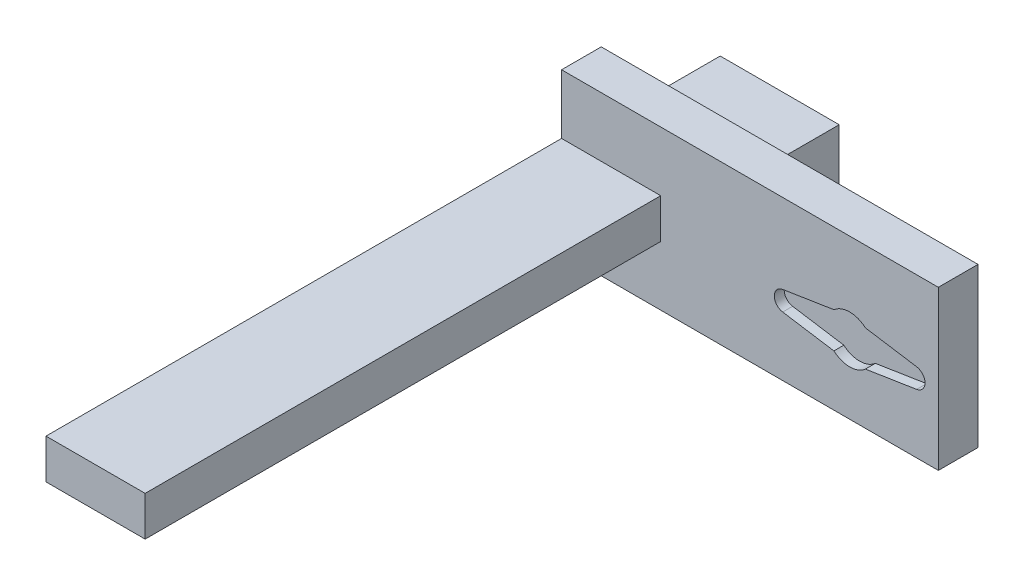
ISO-10303-21;
HEADER;
FILE_DESCRIPTION(('STEP AP214'),'2;1');
FILE_NAME('part.step','',(''),(''),'','','');
FILE_SCHEMA(('AUTOMOTIVE_DESIGN { 1 0 10303 214 1 1 1 1 }'));
ENDSEC;
DATA;
#1=APPLICATION_CONTEXT('core data for automotive mechanical design processes');
#2=APPLICATION_PROTOCOL_DEFINITION('international standard','automotive_design',2000,#1);
#3=PRODUCT_CONTEXT('',#1,'mechanical');
#4=PRODUCT('Part','Part','',(#3));
#5=PRODUCT_RELATED_PRODUCT_CATEGORY('part','',(#4));
#6=PRODUCT_DEFINITION_FORMATION('','',#4);
#7=PRODUCT_DEFINITION_CONTEXT('part definition',#1,'design');
#8=PRODUCT_DEFINITION('design','',#6,#7);
#9=PRODUCT_DEFINITION_SHAPE('','',#8);
#10=(LENGTH_UNIT() NAMED_UNIT(*) SI_UNIT(.MILLI.,.METRE.));
#11=(NAMED_UNIT(*) PLANE_ANGLE_UNIT() SI_UNIT($,.RADIAN.));
#12=(NAMED_UNIT(*) SI_UNIT($,.STERADIAN.) SOLID_ANGLE_UNIT());
#13=UNCERTAINTY_MEASURE_WITH_UNIT(LENGTH_MEASURE(1.E-05),#10,'distance_accuracy_value','');
#14=(GEOMETRIC_REPRESENTATION_CONTEXT(3) GLOBAL_UNCERTAINTY_ASSIGNED_CONTEXT((#13)) GLOBAL_UNIT_ASSIGNED_CONTEXT((#10,
#11,#12)) REPRESENTATION_CONTEXT('',''));
#15=CARTESIAN_POINT('',(0.,0.,0.));
#16=DIRECTION('',(0.,0.,1.));
#17=DIRECTION('',(1.,0.,0.));
#18=AXIS2_PLACEMENT_3D('',#15,#16,#17);
#19=CARTESIAN_POINT('',(0.,0.,-10.));
#20=DIRECTION('',(0.,0.,-1.));
#21=DIRECTION('',(-1.,0.,0.));
#22=AXIS2_PLACEMENT_3D('',#19,#20,#21);
#23=PLANE('',#22);
#24=DIRECTION('',(-1.,0.,0.));
#25=VECTOR('',#24,1.);
#26=CARTESIAN_POINT('',(-72.6388455394187,-8.94111545042943,-10.));
#27=LINE('',#26,#25);
#28=CARTESIAN_POINT('',(-42.6388455394187,-8.94111545042943,-10.));
#29=VERTEX_POINT('',#28);
#30=CARTESIAN_POINT('',(-72.6388455394187,-8.94111545042943,-10.));
#31=VERTEX_POINT('',#30);
#32=EDGE_CURVE('E210',#29,#31,#27,.T.);
#33=ORIENTED_EDGE('',*,*,#32,.F.);
#34=DIRECTION('',(0.,-1.,0.));
#35=VECTOR('',#34,1.);
#36=CARTESIAN_POINT('',(-42.6388455394187,5.55888454957057,-10.));
#37=LINE('',#36,#35);
#38=CARTESIAN_POINT('',(-42.6388455394187,5.55888454957057,-10.));
#39=VERTEX_POINT('',#38);
#40=EDGE_CURVE('E195',#39,#29,#37,.T.);
#41=ORIENTED_EDGE('',*,*,#40,.F.);
#42=DIRECTION('',(1.,0.,0.));
#43=VECTOR('',#42,1.);
#44=CARTESIAN_POINT('',(-42.6388455394187,5.55888454957057,-10.));
#45=LINE('',#44,#43);
#46=CARTESIAN_POINT('',(-72.6388455394187,5.55888454957057,-10.));
#47=VERTEX_POINT('',#46);
#48=EDGE_CURVE('E61',#47,#39,#45,.T.);
#49=ORIENTED_EDGE('',*,*,#48,.F.);
#50=DIRECTION('',(0.,-1.,0.));
#51=VECTOR('',#50,1.);
#52=CARTESIAN_POINT('',(-72.6388455394187,22.5588845495706,-10.));
#53=LINE('',#52,#51);
#54=CARTESIAN_POINT('',(-72.6388455394187,22.5588845495706,-10.));
#55=VERTEX_POINT('',#54);
#56=EDGE_CURVE('E271',#55,#47,#53,.T.);
#57=ORIENTED_EDGE('',*,*,#56,.F.);
#58=DIRECTION('',(-1.,0.,0.));
#59=VECTOR('',#58,1.);
#60=CARTESIAN_POINT('',(22.3611544605813,22.5588845495706,-10.));
#61=LINE('',#60,#59);
#62=CARTESIAN_POINT('',(22.3611544605813,22.5588845495706,-10.));
#63=VERTEX_POINT('',#62);
#64=EDGE_CURVE('E291',#63,#55,#61,.T.);
#65=ORIENTED_EDGE('',*,*,#64,.F.);
#66=DIRECTION('',(0.,1.,0.));
#67=VECTOR('',#66,1.);
#68=CARTESIAN_POINT('',(22.3611544605813,-7.44111545042943,-10.));
#69=LINE('',#68,#67);
#70=CARTESIAN_POINT('',(22.3611544605813,-17.4411154504294,-10.));
#71=VERTEX_POINT('',#70);
#72=EDGE_CURVE('E11',#71,#63,#69,.T.);
#73=ORIENTED_EDGE('',*,*,#72,.F.);
#74=DIRECTION('',(1.,0.,0.));
#75=VECTOR('',#74,1.);
#76=CARTESIAN_POINT('',(22.3611544605813,-17.4411154504294,-10.));
#77=LINE('',#76,#75);
#78=CARTESIAN_POINT('',(-72.6388455394187,-17.4411154504294,-10.));
#79=VERTEX_POINT('',#78);
#80=EDGE_CURVE('E305',#79,#71,#77,.T.);
#81=ORIENTED_EDGE('',*,*,#80,.F.);
#82=EDGE_CURVE('E270',#31,#79,#53,.T.);
#83=ORIENTED_EDGE('',*,*,#82,.F.);
#84=EDGE_LOOP('',(#33,#41,#49,#57,#65,#73,#81,#83));
#85=FACE_BOUND('',#84,.T.);
#86=ADVANCED_FACE('F45',(#85),#23,.T.);
#87=CARTESIAN_POINT('',(0.,0.,0.));
#88=DIRECTION('',(0.,0.,-1.));
#89=DIRECTION('',(-1.,0.,0.));
#90=AXIS2_PLACEMENT_3D('',#87,#88,#89);
#91=PLANE('',#90);
#92=DIRECTION('',(0.987875892570632,-0.155245679095352,0.));
#93=VECTOR('',#92,1.);
#94=CARTESIAN_POINT('',(-16.8881141977384,-2.46968973142658,0.));
#95=LINE('',#94,#93);
#96=CARTESIAN_POINT('',(-16.8881141977384,-2.46968973142658,0.));
#97=VERTEX_POINT('',#96);
#98=CARTESIAN_POINT('',(-3.96862696659689,-4.5,0.));
#99=VERTEX_POINT('',#98);
#100=EDGE_CURVE('E346',#97,#99,#95,.T.);
#101=ORIENTED_EDGE('',*,*,#100,.F.);
#102=CARTESIAN_POINT('',(-16.5,0.,0.));
#103=DIRECTION('',(0.,0.,1.));
#104=DIRECTION('',(1.,0.,0.));
#105=AXIS2_PLACEMENT_3D('',#102,#103,#104);
#106=CIRCLE('',#105,2.5);
#107=CARTESIAN_POINT('',(-16.8881141977384,2.46968973142658,0.));
#108=VERTEX_POINT('',#107);
#109=EDGE_CURVE('E309',#108,#97,#106,.T.);
#110=ORIENTED_EDGE('',*,*,#109,.F.);
#111=DIRECTION('',(-0.987875892570632,-0.155245679095352,0.));
#112=VECTOR('',#111,1.);
#113=CARTESIAN_POINT('',(-16.8881141977384,2.46968973142658,0.));
#114=LINE('',#113,#112);
#115=CARTESIAN_POINT('',(-3.96862696659689,4.5,0.));
#116=VERTEX_POINT('',#115);
#117=EDGE_CURVE('E315',#116,#108,#114,.T.);
#118=ORIENTED_EDGE('',*,*,#117,.F.);
#119=CARTESIAN_POINT('',(0.,0.,0.));
#120=DIRECTION('',(0.,0.,1.));
#121=DIRECTION('',(-1.,0.,0.));
#122=AXIS2_PLACEMENT_3D('',#119,#120,#121);
#123=CIRCLE('',#122,6.00000000000002);
#124=CARTESIAN_POINT('',(3.96862696659689,4.5,0.));
#125=VERTEX_POINT('',#124);
#126=EDGE_CURVE('E366',#125,#116,#123,.T.);
#127=ORIENTED_EDGE('',*,*,#126,.F.);
#128=DIRECTION('',(-0.987875892570632,0.155245679095352,0.));
#129=VECTOR('',#128,1.);
#130=CARTESIAN_POINT('',(3.96862696659689,4.5,0.));
#131=LINE('',#130,#129);
#132=CARTESIAN_POINT('',(16.8881141977384,2.46968973142658,0.));
#133=VERTEX_POINT('',#132);
#134=EDGE_CURVE('E362',#133,#125,#131,.T.);
#135=ORIENTED_EDGE('',*,*,#134,.F.);
#136=CARTESIAN_POINT('',(16.5,0.,0.));
#137=DIRECTION('',(0.,0.,1.));
#138=DIRECTION('',(1.,0.,0.));
#139=AXIS2_PLACEMENT_3D('',#136,#137,#138);
#140=CIRCLE('',#139,2.5);
#141=CARTESIAN_POINT('',(16.8881141977384,-2.46968973142658,0.));
#142=VERTEX_POINT('',#141);
#143=EDGE_CURVE('E358',#142,#133,#140,.T.);
#144=ORIENTED_EDGE('',*,*,#143,.F.);
#145=DIRECTION('',(0.987875892570632,0.155245679095352,0.));
#146=VECTOR('',#145,1.);
#147=CARTESIAN_POINT('',(16.8881141977384,-2.46968973142658,0.));
#148=LINE('',#147,#146);
#149=CARTESIAN_POINT('',(3.96862696659689,-4.5,0.));
#150=VERTEX_POINT('',#149);
#151=EDGE_CURVE('E354',#150,#142,#148,.T.);
#152=ORIENTED_EDGE('',*,*,#151,.F.);
#153=CARTESIAN_POINT('',(0.,0.,0.));
#154=DIRECTION('',(0.,0.,1.));
#155=DIRECTION('',(1.,0.,0.));
#156=AXIS2_PLACEMENT_3D('',#153,#154,#155);
#157=CIRCLE('',#156,6.00000000000001);
#158=EDGE_CURVE('E350',#99,#150,#157,.T.);
#159=ORIENTED_EDGE('',*,*,#158,.F.);
#160=EDGE_LOOP('',(#101,#110,#118,#127,#135,#144,#152,#159));
#161=FACE_BOUND('',#160,.T.);
#162=DIRECTION('',(-1.,0.,0.));
#163=VECTOR('',#162,1.);
#164=CARTESIAN_POINT('',(-72.6388455394187,7.55888454957057,0.));
#165=LINE('',#164,#163);
#166=CARTESIAN_POINT('',(-47.6388455394187,7.55888454957057,0.));
#167=VERTEX_POINT('',#166);
#168=CARTESIAN_POINT('',(-72.6388455394187,7.55888454957057,0.));
#169=VERTEX_POINT('',#168);
#170=EDGE_CURVE('E69',#167,#169,#165,.T.);
#171=ORIENTED_EDGE('',*,*,#170,.F.);
#172=DIRECTION('',(0.,1.,0.));
#173=VECTOR('',#172,1.);
#174=CARTESIAN_POINT('',(-47.6388455394187,7.55888454957057,0.));
#175=LINE('',#174,#173);
#176=CARTESIAN_POINT('',(-47.6388455394187,-2.44111545042943,0.));
#177=VERTEX_POINT('',#176);
#178=EDGE_CURVE('E250',#177,#167,#175,.T.);
#179=ORIENTED_EDGE('',*,*,#178,.F.);
#180=DIRECTION('',(1.,0.,0.));
#181=VECTOR('',#180,1.);
#182=CARTESIAN_POINT('',(-72.6388455394187,-2.44111545042943,0.));
#183=LINE('',#182,#181);
#184=CARTESIAN_POINT('',(-72.6388455394187,-2.44111545042943,0.));
#185=VERTEX_POINT('',#184);
#186=EDGE_CURVE('E232',#185,#177,#183,.T.);
#187=ORIENTED_EDGE('',*,*,#186,.F.);
#188=DIRECTION('',(0.,1.,0.));
#189=VECTOR('',#188,1.);
#190=CARTESIAN_POINT('',(-72.6388455394187,22.5588845495706,0.));
#191=LINE('',#190,#189);
#192=CARTESIAN_POINT('',(-72.6388455394187,-17.4411154504294,0.));
#193=VERTEX_POINT('',#192);
#194=EDGE_CURVE('E279',#193,#185,#191,.T.);
#195=ORIENTED_EDGE('',*,*,#194,.F.);
#196=DIRECTION('',(-1.,0.,0.));
#197=VECTOR('',#196,1.);
#198=CARTESIAN_POINT('',(22.3611544605813,-17.4411154504294,0.));
#199=LINE('',#198,#197);
#200=CARTESIAN_POINT('',(22.3611544605813,-17.4411154504294,0.));
#201=VERTEX_POINT('',#200);
#202=EDGE_CURVE('E302',#201,#193,#199,.T.);
#203=ORIENTED_EDGE('',*,*,#202,.F.);
#204=DIRECTION('',(0.,1.,0.));
#205=VECTOR('',#204,1.);
#206=CARTESIAN_POINT('',(22.3611544605813,-7.44111545042943,0.));
#207=LINE('',#206,#205);
#208=CARTESIAN_POINT('',(22.3611544605813,22.5588845495706,0.));
#209=VERTEX_POINT('',#208);
#210=EDGE_CURVE('E49',#201,#209,#207,.T.);
#211=ORIENTED_EDGE('',*,*,#210,.T.);
#212=DIRECTION('',(1.,0.,0.));
#213=VECTOR('',#212,1.);
#214=CARTESIAN_POINT('',(22.3611544605813,22.5588845495706,0.));
#215=LINE('',#214,#213);
#216=CARTESIAN_POINT('',(-72.6388455394187,22.5588845495706,0.));
#217=VERTEX_POINT('',#216);
#218=EDGE_CURVE('E294',#217,#209,#215,.T.);
#219=ORIENTED_EDGE('',*,*,#218,.F.);
#220=EDGE_CURVE('E278',#169,#217,#191,.T.);
#221=ORIENTED_EDGE('',*,*,#220,.F.);
#222=EDGE_LOOP('',(#171,#179,#187,#195,#203,#211,#219,#221));
#223=FACE_BOUND('',#222,.T.);
#224=ADVANCED_FACE('F405',(#161,#223),#91,.F.);
#225=CARTESIAN_POINT('',(22.3611544605813,-7.44111545042943,-10.));
#226=DIRECTION('',(1.,0.,0.));
#227=DIRECTION('',(0.,0.,-1.));
#228=AXIS2_PLACEMENT_3D('',#225,#226,#227);
#229=PLANE('',#228);
#230=ORIENTED_EDGE('',*,*,#210,.F.);
#231=DIRECTION('',(0.,0.,1.));
#232=VECTOR('',#231,1.);
#233=CARTESIAN_POINT('',(22.3611544605813,-17.4411154504294,-10.));
#234=LINE('',#233,#232);
#235=EDGE_CURVE('E298',#71,#201,#234,.T.);
#236=ORIENTED_EDGE('',*,*,#235,.F.);
#237=ORIENTED_EDGE('',*,*,#72,.T.);
#238=DIRECTION('',(0.,0.,-1.));
#239=VECTOR('',#238,1.);
#240=CARTESIAN_POINT('',(22.3611544605813,22.5588845495706,-10.));
#241=LINE('',#240,#239);
#242=EDGE_CURVE('E287',#209,#63,#241,.T.);
#243=ORIENTED_EDGE('',*,*,#242,.F.);
#244=EDGE_LOOP('',(#230,#236,#237,#243));
#245=FACE_BOUND('',#244,.T.);
#246=ADVANCED_FACE('F47',(#245),#229,.T.);
#247=CARTESIAN_POINT('',(-16.5,0.,-2.5));
#248=DIRECTION('',(0.,0.,1.));
#249=DIRECTION('',(1.,0.,0.));
#250=AXIS2_PLACEMENT_3D('',#247,#248,#249);
#251=CYLINDRICAL_SURFACE('',#250,2.5);
#252=ORIENTED_EDGE('',*,*,#109,.T.);
#253=DIRECTION('',(0.,0.,1.));
#254=VECTOR('',#253,1.);
#255=CARTESIAN_POINT('',(-16.8881141977384,-2.46968973142658,-2.5));
#256=LINE('',#255,#254);
#257=CARTESIAN_POINT('',(-16.8881141977384,-2.46968973142658,-2.5));
#258=VERTEX_POINT('',#257);
#259=EDGE_CURVE('E343',#258,#97,#256,.T.);
#260=ORIENTED_EDGE('',*,*,#259,.F.);
#261=CARTESIAN_POINT('',(-16.5,0.,-2.5));
#262=DIRECTION('',(0.,0.,1.));
#263=DIRECTION('',(1.,0.,0.));
#264=AXIS2_PLACEMENT_3D('',#261,#262,#263);
#265=CIRCLE('',#264,2.5);
#266=CARTESIAN_POINT('',(-16.8881141977384,2.46968973142658,-2.5));
#267=VERTEX_POINT('',#266);
#268=EDGE_CURVE('E310',#267,#258,#265,.T.);
#269=ORIENTED_EDGE('',*,*,#268,.F.);
#270=DIRECTION('',(0.,0.,1.));
#271=VECTOR('',#270,1.);
#272=CARTESIAN_POINT('',(-16.8881141977384,2.46968973142658,-2.5));
#273=LINE('',#272,#271);
#274=EDGE_CURVE('E373',#267,#108,#273,.T.);
#275=ORIENTED_EDGE('',*,*,#274,.T.);
#276=EDGE_LOOP('',(#252,#260,#269,#275));
#277=FACE_BOUND('',#276,.T.);
#278=ADVANCED_FACE('F416',(#277),#251,.F.);
#279=CARTESIAN_POINT('',(-16.8881141977384,2.46968973142658,-2.5));
#280=DIRECTION('',(-0.155245679095352,0.987875892570632,0.));
#281=DIRECTION('',(-0.987875892570632,-0.155245679095352,0.));
#282=AXIS2_PLACEMENT_3D('',#279,#280,#281);
#283=PLANE('',#282);
#284=ORIENTED_EDGE('',*,*,#117,.T.);
#285=ORIENTED_EDGE('',*,*,#274,.F.);
#286=DIRECTION('',(-0.987875892570632,-0.155245679095352,0.));
#287=VECTOR('',#286,1.);
#288=CARTESIAN_POINT('',(-16.8881141977384,2.46968973142658,-2.5));
#289=LINE('',#288,#287);
#290=CARTESIAN_POINT('',(-3.96862696659689,4.5,-2.5));
#291=VERTEX_POINT('',#290);
#292=EDGE_CURVE('E339',#291,#267,#289,.T.);
#293=ORIENTED_EDGE('',*,*,#292,.F.);
#294=DIRECTION('',(0.,0.,1.));
#295=VECTOR('',#294,1.);
#296=CARTESIAN_POINT('',(-3.96862696659689,4.5,-2.5));
#297=LINE('',#296,#295);
#298=EDGE_CURVE('E376',#291,#116,#297,.T.);
#299=ORIENTED_EDGE('',*,*,#298,.T.);
#300=EDGE_LOOP('',(#284,#285,#293,#299));
#301=FACE_BOUND('',#300,.T.);
#302=ADVANCED_FACE('F418',(#301),#283,.F.);
#303=CARTESIAN_POINT('',(0.,0.,-2.5));
#304=DIRECTION('',(0.,0.,1.));
#305=DIRECTION('',(1.,0.,0.));
#306=AXIS2_PLACEMENT_3D('',#303,#304,#305);
#307=CYLINDRICAL_SURFACE('',#306,6.00000000000002);
#308=ORIENTED_EDGE('',*,*,#126,.T.);
#309=ORIENTED_EDGE('',*,*,#298,.F.);
#310=CARTESIAN_POINT('',(0.,0.,-2.5));
#311=DIRECTION('',(0.,0.,1.));
#312=DIRECTION('',(-1.,0.,0.));
#313=AXIS2_PLACEMENT_3D('',#310,#311,#312);
#314=CIRCLE('',#313,6.00000000000002);
#315=CARTESIAN_POINT('',(3.96862696659689,4.5,-2.5));
#316=VERTEX_POINT('',#315);
#317=EDGE_CURVE('E335',#316,#291,#314,.T.);
#318=ORIENTED_EDGE('',*,*,#317,.F.);
#319=DIRECTION('',(0.,0.,1.));
#320=VECTOR('',#319,1.);
#321=CARTESIAN_POINT('',(3.96862696659689,4.5,-2.5));
#322=LINE('',#321,#320);
#323=EDGE_CURVE('E379',#316,#125,#322,.T.);
#324=ORIENTED_EDGE('',*,*,#323,.T.);
#325=EDGE_LOOP('',(#308,#309,#318,#324));
#326=FACE_BOUND('',#325,.T.);
#327=ADVANCED_FACE('F422',(#326),#307,.F.);
#328=CARTESIAN_POINT('',(3.96862696659689,4.5,-2.5));
#329=DIRECTION('',(0.155245679095352,0.987875892570632,0.));
#330=DIRECTION('',(-0.987875892570632,0.155245679095352,0.));
#331=AXIS2_PLACEMENT_3D('',#328,#329,#330);
#332=PLANE('',#331);
#333=ORIENTED_EDGE('',*,*,#134,.T.);
#334=ORIENTED_EDGE('',*,*,#323,.F.);
#335=DIRECTION('',(-0.987875892570632,0.155245679095352,0.));
#336=VECTOR('',#335,1.);
#337=CARTESIAN_POINT('',(3.96862696659689,4.5,-2.5));
#338=LINE('',#337,#336);
#339=CARTESIAN_POINT('',(16.8881141977384,2.46968973142658,-2.5));
#340=VERTEX_POINT('',#339);
#341=EDGE_CURVE('E331',#340,#316,#338,.T.);
#342=ORIENTED_EDGE('',*,*,#341,.F.);
#343=DIRECTION('',(0.,0.,1.));
#344=VECTOR('',#343,1.);
#345=CARTESIAN_POINT('',(16.8881141977384,2.46968973142658,-2.5));
#346=LINE('',#345,#344);
#347=EDGE_CURVE('E382',#340,#133,#346,.T.);
#348=ORIENTED_EDGE('',*,*,#347,.T.);
#349=EDGE_LOOP('',(#333,#334,#342,#348));
#350=FACE_BOUND('',#349,.T.);
#351=ADVANCED_FACE('F426',(#350),#332,.F.);
#352=CARTESIAN_POINT('',(16.5,0.,-2.5));
#353=DIRECTION('',(0.,0.,1.));
#354=DIRECTION('',(1.,0.,0.));
#355=AXIS2_PLACEMENT_3D('',#352,#353,#354);
#356=CYLINDRICAL_SURFACE('',#355,2.5);
#357=ORIENTED_EDGE('',*,*,#143,.T.);
#358=ORIENTED_EDGE('',*,*,#347,.F.);
#359=CARTESIAN_POINT('',(16.5,0.,-2.5));
#360=DIRECTION('',(0.,0.,1.));
#361=DIRECTION('',(1.,0.,0.));
#362=AXIS2_PLACEMENT_3D('',#359,#360,#361);
#363=CIRCLE('',#362,2.5);
#364=CARTESIAN_POINT('',(16.8881141977384,-2.46968973142658,-2.5));
#365=VERTEX_POINT('',#364);
#366=EDGE_CURVE('E327',#365,#340,#363,.T.);
#367=ORIENTED_EDGE('',*,*,#366,.F.);
#368=DIRECTION('',(0.,0.,1.));
#369=VECTOR('',#368,1.);
#370=CARTESIAN_POINT('',(16.8881141977384,-2.46968973142658,-2.5));
#371=LINE('',#370,#369);
#372=EDGE_CURVE('E385',#365,#142,#371,.T.);
#373=ORIENTED_EDGE('',*,*,#372,.T.);
#374=EDGE_LOOP('',(#357,#358,#367,#373));
#375=FACE_BOUND('',#374,.T.);
#376=ADVANCED_FACE('F429',(#375),#356,.F.);
#377=CARTESIAN_POINT('',(16.8881141977384,-2.46968973142658,-2.5));
#378=DIRECTION('',(0.155245679095352,-0.987875892570632,0.));
#379=DIRECTION('',(0.987875892570632,0.155245679095352,0.));
#380=AXIS2_PLACEMENT_3D('',#377,#378,#379);
#381=PLANE('',#380);
#382=ORIENTED_EDGE('',*,*,#151,.T.);
#383=ORIENTED_EDGE('',*,*,#372,.F.);
#384=DIRECTION('',(0.987875892570632,0.155245679095352,0.));
#385=VECTOR('',#384,1.);
#386=CARTESIAN_POINT('',(16.8881141977384,-2.46968973142658,-2.5));
#387=LINE('',#386,#385);
#388=CARTESIAN_POINT('',(3.96862696659689,-4.5,-2.5));
#389=VERTEX_POINT('',#388);
#390=EDGE_CURVE('E323',#389,#365,#387,.T.);
#391=ORIENTED_EDGE('',*,*,#390,.F.);
#392=DIRECTION('',(0.,0.,1.));
#393=VECTOR('',#392,1.);
#394=CARTESIAN_POINT('',(3.96862696659689,-4.5,-2.5));
#395=LINE('',#394,#393);
#396=EDGE_CURVE('E388',#389,#150,#395,.T.);
#397=ORIENTED_EDGE('',*,*,#396,.T.);
#398=EDGE_LOOP('',(#382,#383,#391,#397));
#399=FACE_BOUND('',#398,.T.);
#400=ADVANCED_FACE('F431',(#399),#381,.F.);
#401=CARTESIAN_POINT('',(0.,0.,-2.5));
#402=DIRECTION('',(0.,0.,1.));
#403=DIRECTION('',(1.,0.,0.));
#404=AXIS2_PLACEMENT_3D('',#401,#402,#403);
#405=CYLINDRICAL_SURFACE('',#404,6.00000000000001);
#406=ORIENTED_EDGE('',*,*,#158,.T.);
#407=ORIENTED_EDGE('',*,*,#396,.F.);
#408=CARTESIAN_POINT('',(0.,0.,-2.5));
#409=DIRECTION('',(0.,0.,1.));
#410=DIRECTION('',(1.,0.,0.));
#411=AXIS2_PLACEMENT_3D('',#408,#409,#410);
#412=CIRCLE('',#411,6.00000000000001);
#413=CARTESIAN_POINT('',(-3.96862696659689,-4.5,-2.5));
#414=VERTEX_POINT('',#413);
#415=EDGE_CURVE('E319',#414,#389,#412,.T.);
#416=ORIENTED_EDGE('',*,*,#415,.F.);
#417=DIRECTION('',(0.,0.,1.));
#418=VECTOR('',#417,1.);
#419=CARTESIAN_POINT('',(-3.96862696659689,-4.5,-2.5));
#420=LINE('',#419,#418);
#421=EDGE_CURVE('E391',#414,#99,#420,.T.);
#422=ORIENTED_EDGE('',*,*,#421,.T.);
#423=EDGE_LOOP('',(#406,#407,#416,#422));
#424=FACE_BOUND('',#423,.T.);
#425=ADVANCED_FACE('F410',(#424),#405,.F.);
#426=CARTESIAN_POINT('',(-16.8881141977384,-2.46968973142658,-2.5));
#427=DIRECTION('',(-0.155245679095352,-0.987875892570632,0.));
#428=DIRECTION('',(0.987875892570632,-0.155245679095352,0.));
#429=AXIS2_PLACEMENT_3D('',#426,#427,#428);
#430=PLANE('',#429);
#431=ORIENTED_EDGE('',*,*,#100,.T.);
#432=ORIENTED_EDGE('',*,*,#421,.F.);
#433=DIRECTION('',(0.987875892570632,-0.155245679095352,0.));
#434=VECTOR('',#433,1.);
#435=CARTESIAN_POINT('',(-16.8881141977384,-2.46968973142658,-2.5));
#436=LINE('',#435,#434);
#437=EDGE_CURVE('E314',#258,#414,#436,.T.);
#438=ORIENTED_EDGE('',*,*,#437,.F.);
#439=ORIENTED_EDGE('',*,*,#259,.T.);
#440=EDGE_LOOP('',(#431,#432,#438,#439));
#441=FACE_BOUND('',#440,.T.);
#442=ADVANCED_FACE('F399',(#441),#430,.F.);
#443=CARTESIAN_POINT('',(-16.5,0.,-2.5));
#444=DIRECTION('',(0.,0.,1.));
#445=DIRECTION('',(1.,0.,0.));
#446=AXIS2_PLACEMENT_3D('',#443,#444,#445);
#447=PLANE('',#446);
#448=ORIENTED_EDGE('',*,*,#268,.T.);
#449=ORIENTED_EDGE('',*,*,#437,.T.);
#450=ORIENTED_EDGE('',*,*,#415,.T.);
#451=ORIENTED_EDGE('',*,*,#390,.T.);
#452=ORIENTED_EDGE('',*,*,#366,.T.);
#453=ORIENTED_EDGE('',*,*,#341,.T.);
#454=ORIENTED_EDGE('',*,*,#317,.T.);
#455=ORIENTED_EDGE('',*,*,#292,.T.);
#456=EDGE_LOOP('',(#448,#449,#450,#451,#452,#453,#454,#455));
#457=FACE_BOUND('',#456,.T.);
#458=ADVANCED_FACE('F414',(#457),#447,.T.);
#459=CARTESIAN_POINT('',(0.,-17.4411154504294,0.));
#460=DIRECTION('',(0.,-1.,0.));
#461=DIRECTION('',(1.,0.,0.));
#462=AXIS2_PLACEMENT_3D('',#459,#460,#461);
#463=PLANE('',#462);
#464=ORIENTED_EDGE('',*,*,#235,.T.);
#465=ORIENTED_EDGE('',*,*,#202,.T.);
#466=DIRECTION('',(0.,0.,1.));
#467=VECTOR('',#466,1.);
#468=CARTESIAN_POINT('',(-72.6388455394187,-17.4411154504294,-10.));
#469=LINE('',#468,#467);
#470=EDGE_CURVE('E274',#79,#193,#469,.T.);
#471=ORIENTED_EDGE('',*,*,#470,.F.);
#472=ORIENTED_EDGE('',*,*,#80,.T.);
#473=EDGE_LOOP('',(#464,#465,#471,#472));
#474=FACE_BOUND('',#473,.T.);
#475=ADVANCED_FACE('F454',(#474),#463,.T.);
#476=CARTESIAN_POINT('',(0.,22.5588845495706,0.));
#477=DIRECTION('',(0.,-1.,0.));
#478=DIRECTION('',(0.,0.,-1.));
#479=AXIS2_PLACEMENT_3D('',#476,#477,#478);
#480=PLANE('',#479);
#481=ORIENTED_EDGE('',*,*,#242,.T.);
#482=ORIENTED_EDGE('',*,*,#64,.T.);
#483=DIRECTION('',(0.,0.,-1.));
#484=VECTOR('',#483,1.);
#485=CARTESIAN_POINT('',(-72.6388455394187,22.5588845495706,-10.));
#486=LINE('',#485,#484);
#487=EDGE_CURVE('E283',#217,#55,#486,.T.);
#488=ORIENTED_EDGE('',*,*,#487,.F.);
#489=ORIENTED_EDGE('',*,*,#218,.T.);
#490=EDGE_LOOP('',(#481,#482,#488,#489));
#491=FACE_BOUND('',#490,.T.);
#492=ADVANCED_FACE('F460',(#491),#480,.F.);
#493=CARTESIAN_POINT('',(-72.6388455394187,0.,0.));
#494=DIRECTION('',(-1.,0.,0.));
#495=DIRECTION('',(0.,0.,1.));
#496=AXIS2_PLACEMENT_3D('',#493,#494,#495);
#497=PLANE('',#496);
#498=DIRECTION('',(0.,0.,-1.));
#499=VECTOR('',#498,1.);
#500=CARTESIAN_POINT('',(-72.6388455394187,-8.94111545042943,-10.));
#501=LINE('',#500,#499);
#502=CARTESIAN_POINT('',(-72.6388455394187,-8.94111545042943,-40.));
#503=VERTEX_POINT('',#502);
#504=EDGE_CURVE('E188',#31,#503,#501,.T.);
#505=ORIENTED_EDGE('',*,*,#504,.F.);
#506=ORIENTED_EDGE('',*,*,#82,.T.);
#507=ORIENTED_EDGE('',*,*,#470,.T.);
#508=ORIENTED_EDGE('',*,*,#194,.T.);
#509=DIRECTION('',(0.,0.,-1.));
#510=VECTOR('',#509,1.);
#511=CARTESIAN_POINT('',(-72.6388455394187,-2.44111545042943,130.));
#512=LINE('',#511,#510);
#513=CARTESIAN_POINT('',(-72.6388455394187,-2.44111545042943,130.));
#514=VERTEX_POINT('',#513);
#515=EDGE_CURVE('E266',#514,#185,#512,.T.);
#516=ORIENTED_EDGE('',*,*,#515,.F.);
#517=DIRECTION('',(0.,-1.,0.));
#518=VECTOR('',#517,1.);
#519=CARTESIAN_POINT('',(-72.6388455394187,7.55888454957057,130.));
#520=LINE('',#519,#518);
#521=CARTESIAN_POINT('',(-72.6388455394187,7.55888454957057,130.));
#522=VERTEX_POINT('',#521);
#523=EDGE_CURVE('E233',#522,#514,#520,.T.);
#524=ORIENTED_EDGE('',*,*,#523,.F.);
#525=DIRECTION('',(0.,0.,-1.));
#526=VECTOR('',#525,1.);
#527=CARTESIAN_POINT('',(-72.6388455394187,7.55888454957057,130.));
#528=LINE('',#527,#526);
#529=EDGE_CURVE('E246',#522,#169,#528,.T.);
#530=ORIENTED_EDGE('',*,*,#529,.T.);
#531=ORIENTED_EDGE('',*,*,#220,.T.);
#532=ORIENTED_EDGE('',*,*,#487,.T.);
#533=ORIENTED_EDGE('',*,*,#56,.T.);
#534=DIRECTION('',(0.,0.,1.));
#535=VECTOR('',#534,1.);
#536=CARTESIAN_POINT('',(-72.6388455394187,5.55888454957057,-40.));
#537=LINE('',#536,#535);
#538=CARTESIAN_POINT('',(-72.6388455394187,5.55888454957057,-40.));
#539=VERTEX_POINT('',#538);
#540=EDGE_CURVE('E191',#539,#47,#537,.T.);
#541=ORIENTED_EDGE('',*,*,#540,.F.);
#542=DIRECTION('',(0.,1.,0.));
#543=VECTOR('',#542,1.);
#544=CARTESIAN_POINT('',(-72.6388455394187,5.55888454957057,-40.));
#545=LINE('',#544,#543);
#546=EDGE_CURVE('E184',#503,#539,#545,.T.);
#547=ORIENTED_EDGE('',*,*,#546,.F.);
#548=EDGE_LOOP('',(#505,#506,#507,#508,#516,#524,#530,#531,#532,#533,#541,#547));
#549=FACE_BOUND('',#548,.T.);
#550=ADVANCED_FACE('F186',(#549),#497,.T.);
#551=CARTESIAN_POINT('',(-72.6388455394187,-2.44111545042943,130.));
#552=DIRECTION('',(0.,1.,0.));
#553=DIRECTION('',(-1.,0.,0.));
#554=AXIS2_PLACEMENT_3D('',#551,#552,#553);
#555=PLANE('',#554);
#556=ORIENTED_EDGE('',*,*,#186,.T.);
#557=DIRECTION('',(0.,0.,-1.));
#558=VECTOR('',#557,1.);
#559=CARTESIAN_POINT('',(-47.6388455394187,-2.44111545042943,130.));
#560=LINE('',#559,#558);
#561=CARTESIAN_POINT('',(-47.6388455394187,-2.44111545042943,130.));
#562=VERTEX_POINT('',#561);
#563=EDGE_CURVE('E262',#562,#177,#560,.T.);
#564=ORIENTED_EDGE('',*,*,#563,.F.);
#565=DIRECTION('',(1.,0.,0.));
#566=VECTOR('',#565,1.);
#567=CARTESIAN_POINT('',(-72.6388455394187,-2.44111545042943,130.));
#568=LINE('',#567,#566);
#569=EDGE_CURVE('E237',#514,#562,#568,.T.);
#570=ORIENTED_EDGE('',*,*,#569,.F.);
#571=ORIENTED_EDGE('',*,*,#515,.T.);
#572=EDGE_LOOP('',(#556,#564,#570,#571));
#573=FACE_BOUND('',#572,.T.);
#574=ADVANCED_FACE('F538',(#573),#555,.F.);
#575=CARTESIAN_POINT('',(-47.6388455394187,7.55888454957057,130.));
#576=DIRECTION('',(-1.,0.,0.));
#577=DIRECTION('',(0.,0.,1.));
#578=AXIS2_PLACEMENT_3D('',#575,#576,#577);
#579=PLANE('',#578);
#580=ORIENTED_EDGE('',*,*,#178,.T.);
#581=DIRECTION('',(0.,0.,-1.));
#582=VECTOR('',#581,1.);
#583=CARTESIAN_POINT('',(-47.6388455394187,7.55888454957057,130.));
#584=LINE('',#583,#582);
#585=CARTESIAN_POINT('',(-47.6388455394187,7.55888454957057,130.));
#586=VERTEX_POINT('',#585);
#587=EDGE_CURVE('E258',#586,#167,#584,.T.);
#588=ORIENTED_EDGE('',*,*,#587,.F.);
#589=DIRECTION('',(0.,1.,0.));
#590=VECTOR('',#589,1.);
#591=CARTESIAN_POINT('',(-47.6388455394187,7.55888454957057,130.));
#592=LINE('',#591,#590);
#593=EDGE_CURVE('E240',#562,#586,#592,.T.);
#594=ORIENTED_EDGE('',*,*,#593,.F.);
#595=ORIENTED_EDGE('',*,*,#563,.T.);
#596=EDGE_LOOP('',(#580,#588,#594,#595));
#597=FACE_BOUND('',#596,.T.);
#598=ADVANCED_FACE('F563',(#597),#579,.F.);
#599=CARTESIAN_POINT('',(-72.6388455394187,7.55888454957057,130.));
#600=DIRECTION('',(0.,-1.,0.));
#601=DIRECTION('',(0.,0.,-1.));
#602=AXIS2_PLACEMENT_3D('',#599,#600,#601);
#603=PLANE('',#602);
#604=ORIENTED_EDGE('',*,*,#170,.T.);
#605=ORIENTED_EDGE('',*,*,#529,.F.);
#606=DIRECTION('',(-1.,0.,0.));
#607=VECTOR('',#606,1.);
#608=CARTESIAN_POINT('',(-72.6388455394187,7.55888454957057,130.));
#609=LINE('',#608,#607);
#610=EDGE_CURVE('E243',#586,#522,#609,.T.);
#611=ORIENTED_EDGE('',*,*,#610,.F.);
#612=ORIENTED_EDGE('',*,*,#587,.T.);
#613=EDGE_LOOP('',(#604,#605,#611,#612));
#614=FACE_BOUND('',#613,.T.);
#615=ADVANCED_FACE('F572',(#614),#603,.F.);
#616=CARTESIAN_POINT('',(0.,0.,130.));
#617=DIRECTION('',(0.,0.,1.));
#618=DIRECTION('',(1.,0.,0.));
#619=AXIS2_PLACEMENT_3D('',#616,#617,#618);
#620=PLANE('',#619);
#621=ORIENTED_EDGE('',*,*,#523,.T.);
#622=ORIENTED_EDGE('',*,*,#569,.T.);
#623=ORIENTED_EDGE('',*,*,#593,.T.);
#624=ORIENTED_EDGE('',*,*,#610,.T.);
#625=EDGE_LOOP('',(#621,#622,#623,#624));
#626=FACE_BOUND('',#625,.T.);
#627=ADVANCED_FACE('F581',(#626),#620,.T.);
#628=CARTESIAN_POINT('',(-42.6388455394187,5.55888454957057,-40.));
#629=DIRECTION('',(0.,-1.,0.));
#630=DIRECTION('',(0.,0.,-1.));
#631=AXIS2_PLACEMENT_3D('',#628,#629,#630);
#632=PLANE('',#631);
#633=ORIENTED_EDGE('',*,*,#48,.T.);
#634=DIRECTION('',(0.,0.,1.));
#635=VECTOR('',#634,1.);
#636=CARTESIAN_POINT('',(-42.6388455394187,5.55888454957057,-40.));
#637=LINE('',#636,#635);
#638=CARTESIAN_POINT('',(-42.6388455394187,5.55888454957057,-40.));
#639=VERTEX_POINT('',#638);
#640=EDGE_CURVE('E222',#639,#39,#637,.T.);
#641=ORIENTED_EDGE('',*,*,#640,.F.);
#642=DIRECTION('',(1.,0.,0.));
#643=VECTOR('',#642,1.);
#644=CARTESIAN_POINT('',(-42.6388455394187,5.55888454957057,-40.));
#645=LINE('',#644,#643);
#646=EDGE_CURVE('E194',#539,#639,#645,.T.);
#647=ORIENTED_EDGE('',*,*,#646,.F.);
#648=ORIENTED_EDGE('',*,*,#540,.T.);
#649=EDGE_LOOP('',(#633,#641,#647,#648));
#650=FACE_BOUND('',#649,.T.);
#651=ADVANCED_FACE('F590',(#650),#632,.F.);
#652=CARTESIAN_POINT('',(-42.6388455394187,5.55888454957057,-40.));
#653=DIRECTION('',(-1.,0.,0.));
#654=DIRECTION('',(0.,0.,1.));
#655=AXIS2_PLACEMENT_3D('',#652,#653,#654);
#656=PLANE('',#655);
#657=ORIENTED_EDGE('',*,*,#40,.T.);
#658=DIRECTION('',(0.,0.,1.));
#659=VECTOR('',#658,1.);
#660=CARTESIAN_POINT('',(-42.6388455394187,-8.94111545042943,-10.));
#661=LINE('',#660,#659);
#662=CARTESIAN_POINT('',(-42.6388455394187,-8.94111545042943,-40.));
#663=VERTEX_POINT('',#662);
#664=EDGE_CURVE('E206',#663,#29,#661,.T.);
#665=ORIENTED_EDGE('',*,*,#664,.F.);
#666=DIRECTION('',(0.,-1.,0.));
#667=VECTOR('',#666,1.);
#668=CARTESIAN_POINT('',(-42.6388455394187,5.55888454957057,-40.));
#669=LINE('',#668,#667);
#670=EDGE_CURVE('E201',#639,#663,#669,.T.);
#671=ORIENTED_EDGE('',*,*,#670,.F.);
#672=ORIENTED_EDGE('',*,*,#640,.T.);
#673=EDGE_LOOP('',(#657,#665,#671,#672));
#674=FACE_BOUND('',#673,.T.);
#675=ADVANCED_FACE('F598',(#674),#656,.F.);
#676=CARTESIAN_POINT('',(0.,0.,-40.));
#677=DIRECTION('',(0.,0.,-1.));
#678=DIRECTION('',(-1.,0.,0.));
#679=AXIS2_PLACEMENT_3D('',#676,#677,#678);
#680=PLANE('',#679);
#681=ORIENTED_EDGE('',*,*,#546,.T.);
#682=ORIENTED_EDGE('',*,*,#646,.T.);
#683=ORIENTED_EDGE('',*,*,#670,.T.);
#684=DIRECTION('',(1.,0.,0.));
#685=VECTOR('',#684,1.);
#686=CARTESIAN_POINT('',(-72.6388455394187,-8.94111545042943,-40.));
#687=LINE('',#686,#685);
#688=EDGE_CURVE('E198',#503,#663,#687,.T.);
#689=ORIENTED_EDGE('',*,*,#688,.F.);
#690=EDGE_LOOP('',(#681,#682,#683,#689));
#691=FACE_BOUND('',#690,.T.);
#692=ADVANCED_FACE('F199',(#691),#680,.T.);
#693=CARTESIAN_POINT('',(0.,-8.94111545042943,0.));
#694=DIRECTION('',(0.,-1.,0.));
#695=DIRECTION('',(0.,0.,-1.));
#696=AXIS2_PLACEMENT_3D('',#693,#694,#695);
#697=PLANE('',#696);
#698=ORIENTED_EDGE('',*,*,#504,.T.);
#699=ORIENTED_EDGE('',*,*,#688,.T.);
#700=ORIENTED_EDGE('',*,*,#664,.T.);
#701=ORIENTED_EDGE('',*,*,#32,.T.);
#702=EDGE_LOOP('',(#698,#699,#700,#701));
#703=FACE_BOUND('',#702,.T.);
#704=ADVANCED_FACE('F208',(#703),#697,.T.);
#705=CLOSED_SHELL('',(#86,#224,#246,#278,#302,#327,#351,#376,#400,#425,#442,#458,#475,#492,#550,
#574,#598,#615,#627,#651,#675,#692,#704));
#706=MANIFOLD_SOLID_BREP('B2',#705);
#707=ADVANCED_BREP_SHAPE_REPRESENTATION('',(#18,#706),#14);
#708=SHAPE_DEFINITION_REPRESENTATION(#9,#707);
ENDSEC;
END-ISO-10303-21;
